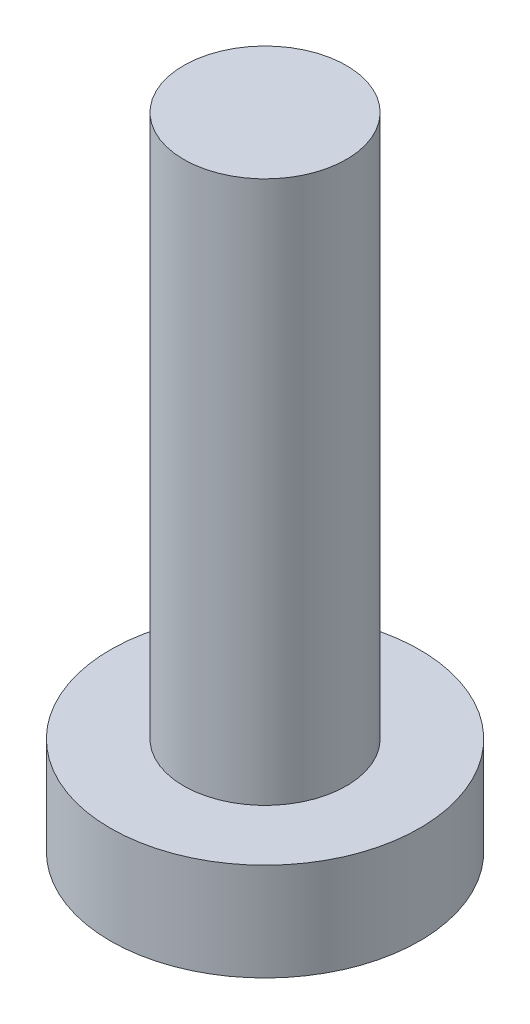
ISO-10303-21;
HEADER;
FILE_DESCRIPTION(('STEP AP214'),'2;1');
FILE_NAME('part.step','',(''),(''),'','','');
FILE_SCHEMA(('AUTOMOTIVE_DESIGN { 1 0 10303 214 1 1 1 1 }'));
ENDSEC;
DATA;
#1=APPLICATION_CONTEXT('core data for automotive mechanical design processes');
#2=APPLICATION_PROTOCOL_DEFINITION('international standard','automotive_design',2000,#1);
#3=PRODUCT_CONTEXT('',#1,'mechanical');
#4=PRODUCT('Part','Part','',(#3));
#5=PRODUCT_RELATED_PRODUCT_CATEGORY('part','',(#4));
#6=PRODUCT_DEFINITION_FORMATION('','',#4);
#7=PRODUCT_DEFINITION_CONTEXT('part definition',#1,'design');
#8=PRODUCT_DEFINITION('design','',#6,#7);
#9=PRODUCT_DEFINITION_SHAPE('','',#8);
#10=(LENGTH_UNIT() NAMED_UNIT(*) SI_UNIT(.MILLI.,.METRE.));
#11=(NAMED_UNIT(*) PLANE_ANGLE_UNIT() SI_UNIT($,.RADIAN.));
#12=(NAMED_UNIT(*) SI_UNIT($,.STERADIAN.) SOLID_ANGLE_UNIT());
#13=UNCERTAINTY_MEASURE_WITH_UNIT(LENGTH_MEASURE(1.E-05),#10,'distance_accuracy_value','');
#14=(GEOMETRIC_REPRESENTATION_CONTEXT(3) GLOBAL_UNCERTAINTY_ASSIGNED_CONTEXT((#13)) GLOBAL_UNIT_ASSIGNED_CONTEXT((#10,
#11,#12)) REPRESENTATION_CONTEXT('',''));
#15=CARTESIAN_POINT('',(0.,0.,0.));
#16=DIRECTION('',(0.,0.,1.));
#17=DIRECTION('',(1.,0.,0.));
#18=AXIS2_PLACEMENT_3D('',#15,#16,#17);
#19=CARTESIAN_POINT('',(0.,0.,0.));
#20=DIRECTION('',(0.,1.,0.));
#21=DIRECTION('',(0.,0.,1.));
#22=AXIS2_PLACEMENT_3D('',#19,#20,#21);
#23=PLANE('',#22);
#24=DIRECTION('',(0.866025403784439,0.,0.5));
#25=VECTOR('',#24,1.);
#26=CARTESIAN_POINT('',(0.,0.,-1.425));
#27=LINE('',#26,#25);
#28=CARTESIAN_POINT('',(0.,0.,-1.425));
#29=VERTEX_POINT('',#28);
#30=CARTESIAN_POINT('',(1.23408620039283,0.,-0.7125));
#31=VERTEX_POINT('',#30);
#32=EDGE_CURVE('E125',#29,#31,#27,.T.);
#33=ORIENTED_EDGE('',*,*,#32,.F.);
#34=DIRECTION('',(0.866025403784439,0.,-0.5));
#35=VECTOR('',#34,1.);
#36=CARTESIAN_POINT('',(-1.23408620039283,0.,-0.7125));
#37=LINE('',#36,#35);
#38=CARTESIAN_POINT('',(-1.23408620039283,0.,-0.7125));
#39=VERTEX_POINT('',#38);
#40=EDGE_CURVE('E51',#39,#29,#37,.T.);
#41=ORIENTED_EDGE('',*,*,#40,.F.);
#42=DIRECTION('',(0.,0.,-1.));
#43=VECTOR('',#42,1.);
#44=CARTESIAN_POINT('',(-1.23408620039283,0.,0.7125));
#45=LINE('',#44,#43);
#46=CARTESIAN_POINT('',(-1.23408620039283,0.,0.7125));
#47=VERTEX_POINT('',#46);
#48=EDGE_CURVE('E134',#47,#39,#45,.T.);
#49=ORIENTED_EDGE('',*,*,#48,.F.);
#50=DIRECTION('',(-0.866025403784439,0.,-0.5));
#51=VECTOR('',#50,1.);
#52=CARTESIAN_POINT('',(0.,0.,1.425));
#53=LINE('',#52,#51);
#54=CARTESIAN_POINT('',(0.,0.,1.425));
#55=VERTEX_POINT('',#54);
#56=EDGE_CURVE('E132',#55,#47,#53,.T.);
#57=ORIENTED_EDGE('',*,*,#56,.F.);
#58=DIRECTION('',(-0.866025403784439,0.,0.5));
#59=VECTOR('',#58,1.);
#60=CARTESIAN_POINT('',(1.23408620039282,0.,0.712500000000001));
#61=LINE('',#60,#59);
#62=CARTESIAN_POINT('',(1.23408620039282,0.,0.712500000000001));
#63=VERTEX_POINT('',#62);
#64=EDGE_CURVE('E99',#63,#55,#61,.T.);
#65=ORIENTED_EDGE('',*,*,#64,.F.);
#66=DIRECTION('',(0.,0.,1.));
#67=VECTOR('',#66,1.);
#68=CARTESIAN_POINT('',(1.23408620039283,0.,-0.7125));
#69=LINE('',#68,#67);
#70=EDGE_CURVE('E128',#31,#63,#69,.T.);
#71=ORIENTED_EDGE('',*,*,#70,.F.);
#72=EDGE_LOOP('',(#33,#41,#49,#57,#65,#71));
#73=FACE_BOUND('',#72,.T.);
#74=CARTESIAN_POINT('',(0.,0.,0.));
#75=DIRECTION('',(0.,1.,0.));
#76=DIRECTION('',(0.,0.,1.));
#77=AXIS2_PLACEMENT_3D('',#74,#75,#76);
#78=CIRCLE('',#77,2.85);
#79=CARTESIAN_POINT('',(0.,0.,2.85));
#80=VERTEX_POINT('',#79);
#81=EDGE_CURVE('E11',#80,#80,#78,.T.);
#82=ORIENTED_EDGE('',*,*,#81,.F.);
#83=EDGE_LOOP('',(#82));
#84=FACE_BOUND('',#83,.T.);
#85=ADVANCED_FACE('F37',(#73,#84),#23,.F.);
#86=CARTESIAN_POINT('',(0.,5.07932498206899,0.));
#87=DIRECTION('',(0.,1.,0.));
#88=DIRECTION('',(0.,0.,1.));
#89=AXIS2_PLACEMENT_3D('',#86,#87,#88);
#90=CYLINDRICAL_SURFACE('',#89,2.85);
#91=CARTESIAN_POINT('',(0.,1.8,0.));
#92=DIRECTION('',(0.,1.,0.));
#93=DIRECTION('',(0.,0.,1.));
#94=AXIS2_PLACEMENT_3D('',#91,#92,#93);
#95=CIRCLE('',#94,2.85);
#96=CARTESIAN_POINT('',(0.,1.8,2.85));
#97=VERTEX_POINT('',#96);
#98=EDGE_CURVE('E44',#97,#97,#95,.T.);
#99=ORIENTED_EDGE('',*,*,#98,.F.);
#100=EDGE_LOOP('',(#99));
#101=FACE_BOUND('',#100,.T.);
#102=ORIENTED_EDGE('',*,*,#81,.T.);
#103=EDGE_LOOP('',(#102));
#104=FACE_BOUND('',#103,.T.);
#105=ADVANCED_FACE('F153',(#101,#104),#90,.T.);
#106=CARTESIAN_POINT('',(2.85,1.8,0.));
#107=DIRECTION('',(0.,-1.,0.));
#108=DIRECTION('',(0.,0.,-1.));
#109=AXIS2_PLACEMENT_3D('',#106,#107,#108);
#110=PLANE('',#109);
#111=CARTESIAN_POINT('',(0.,1.8,0.));
#112=DIRECTION('',(0.,1.,0.));
#113=DIRECTION('',(0.,0.,1.));
#114=AXIS2_PLACEMENT_3D('',#111,#112,#113);
#115=CIRCLE('',#114,1.5);
#116=CARTESIAN_POINT('',(0.,1.8,1.5));
#117=VERTEX_POINT('',#116);
#118=EDGE_CURVE('E146',#117,#117,#115,.T.);
#119=ORIENTED_EDGE('',*,*,#118,.F.);
#120=EDGE_LOOP('',(#119));
#121=FACE_BOUND('',#120,.T.);
#122=ORIENTED_EDGE('',*,*,#98,.T.);
#123=EDGE_LOOP('',(#122));
#124=FACE_BOUND('',#123,.T.);
#125=ADVANCED_FACE('F151',(#121,#124),#110,.F.);
#126=CARTESIAN_POINT('',(0.,5.07932498206899,0.));
#127=DIRECTION('',(0.,1.,0.));
#128=DIRECTION('',(0.,0.,1.));
#129=AXIS2_PLACEMENT_3D('',#126,#127,#128);
#130=CYLINDRICAL_SURFACE('',#129,1.5);
#131=CARTESIAN_POINT('',(0.,11.8,0.));
#132=DIRECTION('',(0.,1.,0.));
#133=DIRECTION('',(0.,0.,1.));
#134=AXIS2_PLACEMENT_3D('',#131,#132,#133);
#135=CIRCLE('',#134,1.5);
#136=CARTESIAN_POINT('',(0.,11.8,1.5));
#137=VERTEX_POINT('',#136);
#138=EDGE_CURVE('E138',#137,#137,#135,.T.);
#139=ORIENTED_EDGE('',*,*,#138,.F.);
#140=EDGE_LOOP('',(#139));
#141=FACE_BOUND('',#140,.T.);
#142=ORIENTED_EDGE('',*,*,#118,.T.);
#143=EDGE_LOOP('',(#142));
#144=FACE_BOUND('',#143,.T.);
#145=ADVANCED_FACE('F178',(#141,#144),#130,.T.);
#146=CARTESIAN_POINT('',(1.5,11.8,0.));
#147=DIRECTION('',(0.,-1.,0.));
#148=DIRECTION('',(0.,0.,-1.));
#149=AXIS2_PLACEMENT_3D('',#146,#147,#148);
#150=PLANE('',#149);
#151=ORIENTED_EDGE('',*,*,#138,.T.);
#152=EDGE_LOOP('',(#151));
#153=FACE_BOUND('',#152,.T.);
#154=ADVANCED_FACE('F171',(#153),#150,.F.);
#155=CARTESIAN_POINT('',(-1.23408620039283,1.5,-0.7125));
#156=DIRECTION('',(-0.5,0.,-0.866025403784439));
#157=DIRECTION('',(-0.866025403784439,0.,0.5));
#158=AXIS2_PLACEMENT_3D('',#155,#156,#157);
#159=PLANE('',#158);
#160=ORIENTED_EDGE('',*,*,#40,.T.);
#161=DIRECTION('',(0.,-1.,0.));
#162=VECTOR('',#161,1.);
#163=CARTESIAN_POINT('',(0.,1.5,-1.425));
#164=LINE('',#163,#162);
#165=CARTESIAN_POINT('',(0.,1.5,-1.425));
#166=VERTEX_POINT('',#165);
#167=EDGE_CURVE('E81',#166,#29,#164,.T.);
#168=ORIENTED_EDGE('',*,*,#167,.F.);
#169=DIRECTION('',(0.866025403784439,0.,-0.5));
#170=VECTOR('',#169,1.);
#171=CARTESIAN_POINT('',(-1.23408620039283,1.5,-0.7125));
#172=LINE('',#171,#170);
#173=CARTESIAN_POINT('',(-1.23408620039283,1.5,-0.7125));
#174=VERTEX_POINT('',#173);
#175=EDGE_CURVE('E136',#174,#166,#172,.T.);
#176=ORIENTED_EDGE('',*,*,#175,.F.);
#177=DIRECTION('',(0.,-1.,0.));
#178=VECTOR('',#177,1.);
#179=CARTESIAN_POINT('',(-1.23408620039283,1.5,-0.7125));
#180=LINE('',#179,#178);
#181=EDGE_CURVE('E59',#174,#39,#180,.T.);
#182=ORIENTED_EDGE('',*,*,#181,.T.);
#183=EDGE_LOOP('',(#160,#168,#176,#182));
#184=FACE_BOUND('',#183,.T.);
#185=ADVANCED_FACE('F168',(#184),#159,.F.);
#186=CARTESIAN_POINT('',(-1.23408620039283,1.5,0.7125));
#187=DIRECTION('',(-1.,0.,0.));
#188=DIRECTION('',(0.,0.,1.));
#189=AXIS2_PLACEMENT_3D('',#186,#187,#188);
#190=PLANE('',#189);
#191=ORIENTED_EDGE('',*,*,#48,.T.);
#192=ORIENTED_EDGE('',*,*,#181,.F.);
#193=DIRECTION('',(0.,0.,-1.));
#194=VECTOR('',#193,1.);
#195=CARTESIAN_POINT('',(-1.23408620039283,1.5,0.7125));
#196=LINE('',#195,#194);
#197=CARTESIAN_POINT('',(-1.23408620039283,1.5,0.7125));
#198=VERTEX_POINT('',#197);
#199=EDGE_CURVE('E111',#198,#174,#196,.T.);
#200=ORIENTED_EDGE('',*,*,#199,.F.);
#201=DIRECTION('',(0.,-1.,0.));
#202=VECTOR('',#201,1.);
#203=CARTESIAN_POINT('',(-1.23408620039283,1.5,0.7125));
#204=LINE('',#203,#202);
#205=EDGE_CURVE('E103',#198,#47,#204,.T.);
#206=ORIENTED_EDGE('',*,*,#205,.T.);
#207=EDGE_LOOP('',(#191,#192,#200,#206));
#208=FACE_BOUND('',#207,.T.);
#209=ADVANCED_FACE('F170',(#208),#190,.F.);
#210=CARTESIAN_POINT('',(0.,1.5,1.425));
#211=DIRECTION('',(-0.5,0.,0.866025403784438));
#212=DIRECTION('',(0.866025403784439,0.,0.5));
#213=AXIS2_PLACEMENT_3D('',#210,#211,#212);
#214=PLANE('',#213);
#215=ORIENTED_EDGE('',*,*,#56,.T.);
#216=ORIENTED_EDGE('',*,*,#205,.F.);
#217=DIRECTION('',(-0.866025403784439,0.,-0.5));
#218=VECTOR('',#217,1.);
#219=CARTESIAN_POINT('',(0.,1.5,1.425));
#220=LINE('',#219,#218);
#221=CARTESIAN_POINT('',(0.,1.5,1.425));
#222=VERTEX_POINT('',#221);
#223=EDGE_CURVE('E107',#222,#198,#220,.T.);
#224=ORIENTED_EDGE('',*,*,#223,.F.);
#225=DIRECTION('',(0.,-1.,0.));
#226=VECTOR('',#225,1.);
#227=CARTESIAN_POINT('',(0.,1.5,1.425));
#228=LINE('',#227,#226);
#229=EDGE_CURVE('E92',#222,#55,#228,.T.);
#230=ORIENTED_EDGE('',*,*,#229,.T.);
#231=EDGE_LOOP('',(#215,#216,#224,#230));
#232=FACE_BOUND('',#231,.T.);
#233=ADVANCED_FACE('F108',(#232),#214,.F.);
#234=CARTESIAN_POINT('',(1.23408620039282,1.5,0.712500000000001));
#235=DIRECTION('',(0.5,0.,0.866025403784439));
#236=DIRECTION('',(0.866025403784439,0.,-0.5));
#237=AXIS2_PLACEMENT_3D('',#234,#235,#236);
#238=PLANE('',#237);
#239=ORIENTED_EDGE('',*,*,#64,.T.);
#240=ORIENTED_EDGE('',*,*,#229,.F.);
#241=DIRECTION('',(-0.866025403784439,0.,0.5));
#242=VECTOR('',#241,1.);
#243=CARTESIAN_POINT('',(1.23408620039282,1.5,0.712500000000001));
#244=LINE('',#243,#242);
#245=CARTESIAN_POINT('',(1.23408620039282,1.5,0.712500000000001));
#246=VERTEX_POINT('',#245);
#247=EDGE_CURVE('E96',#246,#222,#244,.T.);
#248=ORIENTED_EDGE('',*,*,#247,.F.);
#249=DIRECTION('',(0.,-1.,0.));
#250=VECTOR('',#249,1.);
#251=CARTESIAN_POINT('',(1.23408620039282,1.5,0.712500000000001));
#252=LINE('',#251,#250);
#253=EDGE_CURVE('E104',#246,#63,#252,.T.);
#254=ORIENTED_EDGE('',*,*,#253,.T.);
#255=EDGE_LOOP('',(#239,#240,#248,#254));
#256=FACE_BOUND('',#255,.T.);
#257=ADVANCED_FACE('F94',(#256),#238,.F.);
#258=CARTESIAN_POINT('',(1.23408620039283,1.5,-0.7125));
#259=DIRECTION('',(1.,0.,0.));
#260=DIRECTION('',(0.,0.,-1.));
#261=AXIS2_PLACEMENT_3D('',#258,#259,#260);
#262=PLANE('',#261);
#263=ORIENTED_EDGE('',*,*,#70,.T.);
#264=ORIENTED_EDGE('',*,*,#253,.F.);
#265=DIRECTION('',(0.,0.,1.));
#266=VECTOR('',#265,1.);
#267=CARTESIAN_POINT('',(1.23408620039283,1.5,-0.7125));
#268=LINE('',#267,#266);
#269=CARTESIAN_POINT('',(1.23408620039283,1.5,-0.7125));
#270=VERTEX_POINT('',#269);
#271=EDGE_CURVE('E117',#270,#246,#268,.T.);
#272=ORIENTED_EDGE('',*,*,#271,.F.);
#273=DIRECTION('',(0.,-1.,0.));
#274=VECTOR('',#273,1.);
#275=CARTESIAN_POINT('',(1.23408620039283,1.5,-0.7125));
#276=LINE('',#275,#274);
#277=EDGE_CURVE('E141',#270,#31,#276,.T.);
#278=ORIENTED_EDGE('',*,*,#277,.T.);
#279=EDGE_LOOP('',(#263,#264,#272,#278));
#280=FACE_BOUND('',#279,.T.);
#281=ADVANCED_FACE('F235',(#280),#262,.F.);
#282=CARTESIAN_POINT('',(0.,1.5,-1.425));
#283=DIRECTION('',(0.5,0.,-0.866025403784439));
#284=DIRECTION('',(-0.866025403784439,0.,-0.5));
#285=AXIS2_PLACEMENT_3D('',#282,#283,#284);
#286=PLANE('',#285);
#287=ORIENTED_EDGE('',*,*,#32,.T.);
#288=ORIENTED_EDGE('',*,*,#277,.F.);
#289=DIRECTION('',(0.866025403784439,0.,0.5));
#290=VECTOR('',#289,1.);
#291=CARTESIAN_POINT('',(0.,1.5,-1.425));
#292=LINE('',#291,#290);
#293=EDGE_CURVE('E119',#166,#270,#292,.T.);
#294=ORIENTED_EDGE('',*,*,#293,.F.);
#295=ORIENTED_EDGE('',*,*,#167,.T.);
#296=EDGE_LOOP('',(#287,#288,#294,#295));
#297=FACE_BOUND('',#296,.T.);
#298=ADVANCED_FACE('F166',(#297),#286,.F.);
#299=CARTESIAN_POINT('',(0.,1.5,0.));
#300=DIRECTION('',(0.,-1.,0.));
#301=DIRECTION('',(0.,0.,-1.));
#302=AXIS2_PLACEMENT_3D('',#299,#300,#301);
#303=PLANE('',#302);
#304=ORIENTED_EDGE('',*,*,#175,.T.);
#305=ORIENTED_EDGE('',*,*,#293,.T.);
#306=ORIENTED_EDGE('',*,*,#271,.T.);
#307=ORIENTED_EDGE('',*,*,#247,.T.);
#308=ORIENTED_EDGE('',*,*,#223,.T.);
#309=ORIENTED_EDGE('',*,*,#199,.T.);
#310=EDGE_LOOP('',(#304,#305,#306,#307,#308,#309));
#311=FACE_BOUND('',#310,.T.);
#312=ADVANCED_FACE('F114',(#311),#303,.T.);
#313=CLOSED_SHELL('',(#85,#105,#125,#145,#154,#185,#209,#233,#257,#281,#298,#312));
#314=MANIFOLD_SOLID_BREP('B2',#313);
#315=ADVANCED_BREP_SHAPE_REPRESENTATION('',(#18,#314),#14);
#316=SHAPE_DEFINITION_REPRESENTATION(#9,#315);
ENDSEC;
END-ISO-10303-21;
